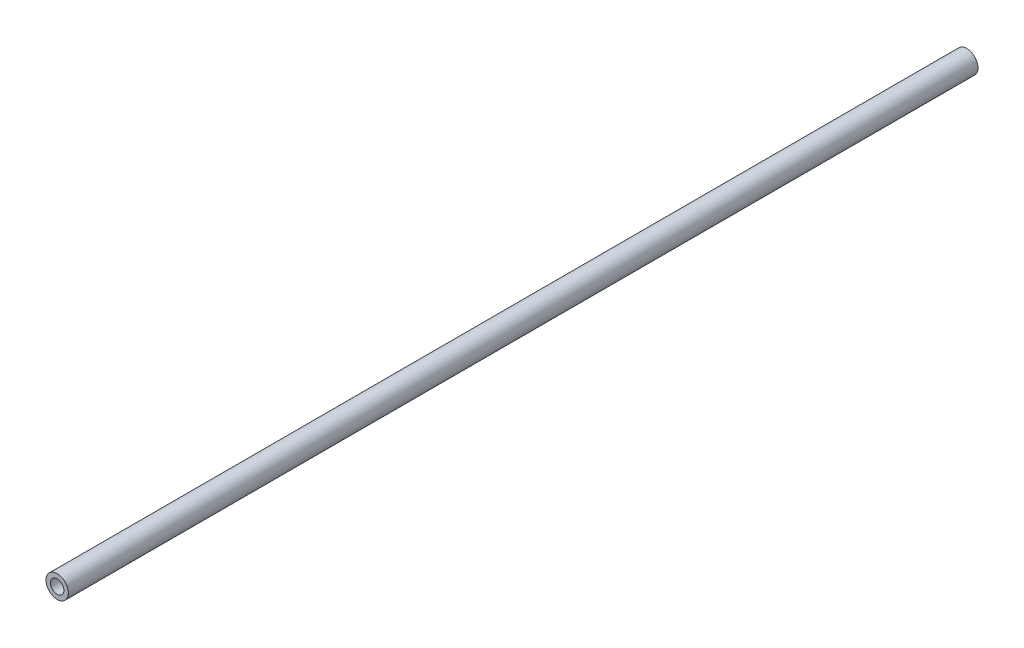
ISO-10303-21;
HEADER;
FILE_DESCRIPTION(('STEP AP214'),'2;1');
FILE_NAME('part.step','',(''),(''),'','','');
FILE_SCHEMA(('AUTOMOTIVE_DESIGN { 1 0 10303 214 1 1 1 1 }'));
ENDSEC;
DATA;
#1=APPLICATION_CONTEXT('core data for automotive mechanical design processes');
#2=APPLICATION_PROTOCOL_DEFINITION('international standard','automotive_design',2000,#1);
#3=PRODUCT_CONTEXT('',#1,'mechanical');
#4=PRODUCT('Part','Part','',(#3));
#5=PRODUCT_RELATED_PRODUCT_CATEGORY('part','',(#4));
#6=PRODUCT_DEFINITION_FORMATION('','',#4);
#7=PRODUCT_DEFINITION_CONTEXT('part definition',#1,'design');
#8=PRODUCT_DEFINITION('design','',#6,#7);
#9=PRODUCT_DEFINITION_SHAPE('','',#8);
#10=(LENGTH_UNIT() NAMED_UNIT(*) SI_UNIT(.MILLI.,.METRE.));
#11=(NAMED_UNIT(*) PLANE_ANGLE_UNIT() SI_UNIT($,.RADIAN.));
#12=(NAMED_UNIT(*) SI_UNIT($,.STERADIAN.) SOLID_ANGLE_UNIT());
#13=UNCERTAINTY_MEASURE_WITH_UNIT(LENGTH_MEASURE(1.E-05),#10,'distance_accuracy_value','');
#14=(GEOMETRIC_REPRESENTATION_CONTEXT(3) GLOBAL_UNCERTAINTY_ASSIGNED_CONTEXT((#13)) GLOBAL_UNIT_ASSIGNED_CONTEXT((#10,
#11,#12)) REPRESENTATION_CONTEXT('',''));
#15=CARTESIAN_POINT('',(0.,0.,0.));
#16=DIRECTION('',(0.,0.,1.));
#17=DIRECTION('',(1.,0.,0.));
#18=AXIS2_PLACEMENT_3D('',#15,#16,#17);
#19=CARTESIAN_POINT('',(0.,0.,203.2));
#20=DIRECTION('',(0.,0.,1.));
#21=DIRECTION('',(1.,0.,0.));
#22=AXIS2_PLACEMENT_3D('',#19,#20,#21);
#23=PLANE('',#22);
#24=CARTESIAN_POINT('',(0.,0.,203.2));
#25=DIRECTION('',(0.,0.,1.));
#26=DIRECTION('',(1.,0.,0.));
#27=AXIS2_PLACEMENT_3D('',#24,#25,#26);
#28=CIRCLE('',#27,2.5);
#29=CARTESIAN_POINT('',(2.5,0.,203.2));
#30=VERTEX_POINT('',#29);
#31=EDGE_CURVE('E12',#30,#30,#28,.T.);
#32=ORIENTED_EDGE('',*,*,#31,.T.);
#33=EDGE_LOOP('',(#32));
#34=FACE_BOUND('',#33,.T.);
#35=CARTESIAN_POINT('',(0.,0.,203.2));
#36=DIRECTION('',(0.,0.,1.));
#37=DIRECTION('',(1.,0.,0.));
#38=AXIS2_PLACEMENT_3D('',#35,#36,#37);
#39=CIRCLE('',#38,1.5);
#40=CARTESIAN_POINT('',(1.5,0.,203.2));
#41=VERTEX_POINT('',#40);
#42=EDGE_CURVE('E53',#41,#41,#39,.T.);
#43=ORIENTED_EDGE('',*,*,#42,.F.);
#44=EDGE_LOOP('',(#43));
#45=FACE_BOUND('',#44,.T.);
#46=ADVANCED_FACE('F42',(#34,#45),#23,.T.);
#47=CARTESIAN_POINT('',(0.,0.,0.));
#48=DIRECTION('',(0.,0.,1.));
#49=DIRECTION('',(1.,0.,0.));
#50=AXIS2_PLACEMENT_3D('',#47,#48,#49);
#51=PLANE('',#50);
#52=CARTESIAN_POINT('',(0.,0.,0.));
#53=DIRECTION('',(0.,0.,1.));
#54=DIRECTION('',(1.,0.,0.));
#55=AXIS2_PLACEMENT_3D('',#52,#53,#54);
#56=CIRCLE('',#55,2.5);
#57=CARTESIAN_POINT('',(2.5,0.,0.));
#58=VERTEX_POINT('',#57);
#59=EDGE_CURVE('E46',#58,#58,#56,.T.);
#60=ORIENTED_EDGE('',*,*,#59,.F.);
#61=EDGE_LOOP('',(#60));
#62=FACE_BOUND('',#61,.T.);
#63=CARTESIAN_POINT('',(0.,0.,0.));
#64=DIRECTION('',(0.,0.,1.));
#65=DIRECTION('',(1.,0.,0.));
#66=AXIS2_PLACEMENT_3D('',#63,#64,#65);
#67=CIRCLE('',#66,1.5);
#68=CARTESIAN_POINT('',(1.5,0.,0.));
#69=VERTEX_POINT('',#68);
#70=EDGE_CURVE('E55',#69,#69,#67,.T.);
#71=ORIENTED_EDGE('',*,*,#70,.T.);
#72=EDGE_LOOP('',(#71));
#73=FACE_BOUND('',#72,.T.);
#74=ADVANCED_FACE('F65',(#62,#73),#51,.F.);
#75=CARTESIAN_POINT('',(0.,0.,203.2));
#76=DIRECTION('',(0.,0.,-1.));
#77=DIRECTION('',(-1.,0.,0.));
#78=AXIS2_PLACEMENT_3D('',#75,#76,#77);
#79=CYLINDRICAL_SURFACE('',#78,2.5);
#80=ORIENTED_EDGE('',*,*,#31,.F.);
#81=EDGE_LOOP('',(#80));
#82=FACE_BOUND('',#81,.T.);
#83=ORIENTED_EDGE('',*,*,#59,.T.);
#84=EDGE_LOOP('',(#83));
#85=FACE_BOUND('',#84,.T.);
#86=ADVANCED_FACE('F44',(#82,#85),#79,.T.);
#87=CARTESIAN_POINT('',(0.,0.,203.2));
#88=DIRECTION('',(0.,0.,-1.));
#89=DIRECTION('',(-1.,0.,0.));
#90=AXIS2_PLACEMENT_3D('',#87,#88,#89);
#91=CYLINDRICAL_SURFACE('',#90,1.5);
#92=ORIENTED_EDGE('',*,*,#42,.T.);
#93=EDGE_LOOP('',(#92));
#94=FACE_BOUND('',#93,.T.);
#95=ORIENTED_EDGE('',*,*,#70,.F.);
#96=EDGE_LOOP('',(#95));
#97=FACE_BOUND('',#96,.T.);
#98=ADVANCED_FACE('F61',(#94,#97),#91,.F.);
#99=CLOSED_SHELL('',(#46,#74,#86,#98));
#100=MANIFOLD_SOLID_BREP('B2',#99);
#101=ADVANCED_BREP_SHAPE_REPRESENTATION('',(#18,#100),#14);
#102=SHAPE_DEFINITION_REPRESENTATION(#9,#101);
ENDSEC;
END-ISO-10303-21;
